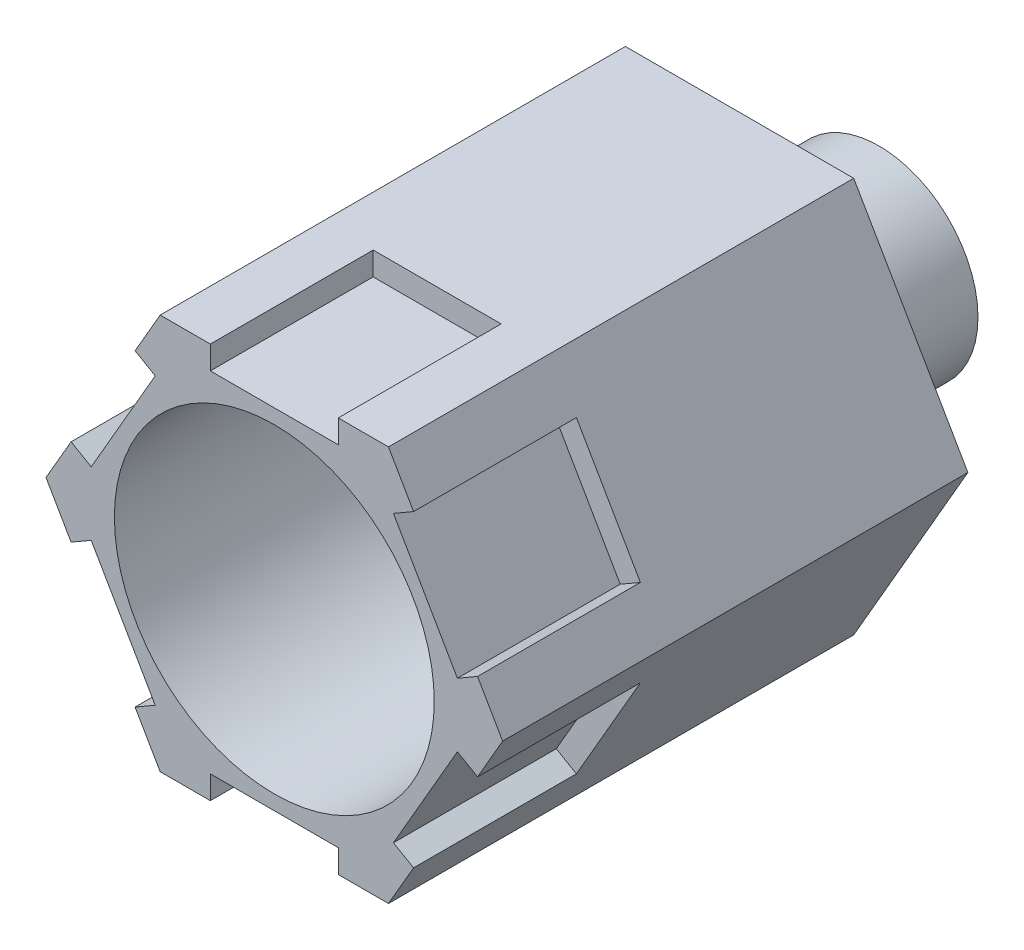
ISO-10303-21;
HEADER;
FILE_DESCRIPTION(('STEP AP214'),'2;1');
FILE_NAME('part.step','',(''),(''),'','','');
FILE_SCHEMA(('AUTOMOTIVE_DESIGN { 1 0 10303 214 1 1 1 1 }'));
ENDSEC;
DATA;
#1=APPLICATION_CONTEXT('core data for automotive mechanical design processes');
#2=APPLICATION_PROTOCOL_DEFINITION('international standard','automotive_design',2000,#1);
#3=PRODUCT_CONTEXT('',#1,'mechanical');
#4=PRODUCT('Part','Part','',(#3));
#5=PRODUCT_RELATED_PRODUCT_CATEGORY('part','',(#4));
#6=PRODUCT_DEFINITION_FORMATION('','',#4);
#7=PRODUCT_DEFINITION_CONTEXT('part definition',#1,'design');
#8=PRODUCT_DEFINITION('design','',#6,#7);
#9=PRODUCT_DEFINITION_SHAPE('','',#8);
#10=(LENGTH_UNIT() NAMED_UNIT(*) SI_UNIT(.MILLI.,.METRE.));
#11=(NAMED_UNIT(*) PLANE_ANGLE_UNIT() SI_UNIT($,.RADIAN.));
#12=(NAMED_UNIT(*) SI_UNIT($,.STERADIAN.) SOLID_ANGLE_UNIT());
#13=UNCERTAINTY_MEASURE_WITH_UNIT(LENGTH_MEASURE(1.E-05),#10,'distance_accuracy_value','');
#14=(GEOMETRIC_REPRESENTATION_CONTEXT(3) GLOBAL_UNCERTAINTY_ASSIGNED_CONTEXT((#13)) GLOBAL_UNIT_ASSIGNED_CONTEXT((#10,
#11,#12)) REPRESENTATION_CONTEXT('',''));
#15=CARTESIAN_POINT('',(0.,0.,0.));
#16=DIRECTION('',(0.,0.,1.));
#17=DIRECTION('',(1.,0.,0.));
#18=AXIS2_PLACEMENT_3D('',#15,#16,#17);
#19=CARTESIAN_POINT('',(0.,0.,38.));
#20=DIRECTION('',(0.,0.,1.));
#21=DIRECTION('',(1.,0.,0.));
#22=AXIS2_PLACEMENT_3D('',#19,#20,#21);
#23=PLANE('',#22);
#24=DIRECTION('',(-0.866025403784438,-0.500000000000001,0.));
#25=VECTOR('',#24,1.);
#26=CARTESIAN_POINT('',(2.15747728811182,13.2631397208144,38.));
#27=LINE('',#26,#25);
#28=CARTESIAN_POINT('',(3.8895280956807,14.2631397208144,38.));
#29=VERTEX_POINT('',#28);
#30=CARTESIAN_POINT('',(2.15747728811182,13.2631397208144,38.));
#31=VERTEX_POINT('',#30);
#32=EDGE_CURVE('E289',#29,#31,#27,.T.);
#33=ORIENTED_EDGE('',*,*,#32,.F.);
#34=DIRECTION('',(-0.5,0.866025403784438,0.));
#35=VECTOR('',#34,1.);
#36=CARTESIAN_POINT('',(3.8895280956807,14.2631397208144,38.));
#37=LINE('',#36,#35);
#38=CARTESIAN_POINT('',(9.3895280956807,4.73686027918559,38.));
#39=VERTEX_POINT('',#38);
#40=EDGE_CURVE('E279',#39,#29,#37,.T.);
#41=ORIENTED_EDGE('',*,*,#40,.F.);
#42=DIRECTION('',(0.866025403784438,0.500000000000001,0.));
#43=VECTOR('',#42,1.);
#44=CARTESIAN_POINT('',(7.65747728811183,3.73686027918559,38.));
#45=LINE('',#44,#43);
#46=CARTESIAN_POINT('',(7.65747728811183,3.73686027918559,38.));
#47=VERTEX_POINT('',#46);
#48=EDGE_CURVE('E291',#47,#39,#45,.T.);
#49=ORIENTED_EDGE('',*,*,#48,.F.);
#50=DIRECTION('',(0.5,-0.866025403784439,0.));
#51=VECTOR('',#50,1.);
#52=CARTESIAN_POINT('',(0.,17.,38.));
#53=LINE('',#52,#51);
#54=CARTESIAN_POINT('',(9.81495457622364,0.,38.));
#55=VERTEX_POINT('',#54);
#56=EDGE_CURVE('E456',#47,#55,#53,.T.);
#57=ORIENTED_EDGE('',*,*,#56,.T.);
#58=DIRECTION('',(1.,0.,0.));
#59=VECTOR('',#58,1.);
#60=CARTESIAN_POINT('',(9.81495457622364,0.,38.));
#61=LINE('',#60,#59);
#62=CARTESIAN_POINT('',(14.1299091524473,0.,38.));
#63=VERTEX_POINT('',#62);
#64=EDGE_CURVE('E461',#55,#63,#61,.T.);
#65=ORIENTED_EDGE('',*,*,#64,.T.);
#66=DIRECTION('',(0.,-1.,0.));
#67=VECTOR('',#66,1.);
#68=CARTESIAN_POINT('',(14.1299091524473,0.,38.));
#69=LINE('',#68,#67);
#70=CARTESIAN_POINT('',(14.1299091524473,2.,38.));
#71=VERTEX_POINT('',#70);
#72=EDGE_CURVE('E299',#71,#63,#69,.T.);
#73=ORIENTED_EDGE('',*,*,#72,.F.);
#74=DIRECTION('',(-1.,0.,0.));
#75=VECTOR('',#74,1.);
#76=CARTESIAN_POINT('',(14.1299091524473,2.,38.));
#77=LINE('',#76,#75);
#78=CARTESIAN_POINT('',(25.1299091524473,2.,38.));
#79=VERTEX_POINT('',#78);
#80=EDGE_CURVE('E412',#79,#71,#77,.T.);
#81=ORIENTED_EDGE('',*,*,#80,.F.);
#82=DIRECTION('',(0.,1.,0.));
#83=VECTOR('',#82,1.);
#84=CARTESIAN_POINT('',(25.1299091524473,0.,38.));
#85=LINE('',#84,#83);
#86=CARTESIAN_POINT('',(25.1299091524473,0.,38.));
#87=VERTEX_POINT('',#86);
#88=EDGE_CURVE('E423',#87,#79,#85,.T.);
#89=ORIENTED_EDGE('',*,*,#88,.F.);
#90=CARTESIAN_POINT('',(29.4448637286709,0.,38.));
#91=VERTEX_POINT('',#90);
#92=EDGE_CURVE('E460',#87,#91,#61,.T.);
#93=ORIENTED_EDGE('',*,*,#92,.T.);
#94=DIRECTION('',(0.5,0.866025403784439,0.));
#95=VECTOR('',#94,1.);
#96=CARTESIAN_POINT('',(29.4448637286709,0.,38.));
#97=LINE('',#96,#95);
#98=CARTESIAN_POINT('',(31.6023410167827,3.7368602791856,38.));
#99=VERTEX_POINT('',#98);
#100=EDGE_CURVE('E443',#91,#99,#97,.T.);
#101=ORIENTED_EDGE('',*,*,#100,.T.);
#102=DIRECTION('',(0.866025403784439,-0.499999999999999,0.));
#103=VECTOR('',#102,1.);
#104=CARTESIAN_POINT('',(31.6023410167827,3.7368602791856,38.));
#105=LINE('',#104,#103);
#106=CARTESIAN_POINT('',(29.8702902092139,4.7368602791856,38.));
#107=VERTEX_POINT('',#106);
#108=EDGE_CURVE('E275',#107,#99,#105,.T.);
#109=ORIENTED_EDGE('',*,*,#108,.F.);
#110=DIRECTION('',(-0.499999999999999,-0.866025403784439,0.));
#111=VECTOR('',#110,1.);
#112=CARTESIAN_POINT('',(29.8702902092139,4.7368602791856,38.));
#113=LINE('',#112,#111);
#114=CARTESIAN_POINT('',(35.3702902092139,14.2631397208144,38.));
#115=VERTEX_POINT('',#114);
#116=EDGE_CURVE('E388',#115,#107,#113,.T.);
#117=ORIENTED_EDGE('',*,*,#116,.F.);
#118=DIRECTION('',(-0.866025403784439,0.499999999999999,0.));
#119=VECTOR('',#118,1.);
#120=CARTESIAN_POINT('',(37.1023410167827,13.2631397208144,38.));
#121=LINE('',#120,#119);
#122=CARTESIAN_POINT('',(37.1023410167827,13.2631397208144,38.));
#123=VERTEX_POINT('',#122);
#124=EDGE_CURVE('E397',#123,#115,#121,.T.);
#125=ORIENTED_EDGE('',*,*,#124,.F.);
#126=CARTESIAN_POINT('',(39.2598183048946,17.,38.));
#127=VERTEX_POINT('',#126);
#128=EDGE_CURVE('E440',#123,#127,#97,.T.);
#129=ORIENTED_EDGE('',*,*,#128,.T.);
#130=DIRECTION('',(-0.5,0.866025403784439,0.));
#131=VECTOR('',#130,1.);
#132=CARTESIAN_POINT('',(39.2598183048946,17.,38.));
#133=LINE('',#132,#131);
#134=CARTESIAN_POINT('',(37.1023410167827,20.7368602791856,38.));
#135=VERTEX_POINT('',#134);
#136=EDGE_CURVE('E243',#127,#135,#133,.T.);
#137=ORIENTED_EDGE('',*,*,#136,.T.);
#138=DIRECTION('',(0.866025403784439,0.5,0.));
#139=VECTOR('',#138,1.);
#140=CARTESIAN_POINT('',(37.1023410167827,20.7368602791856,38.));
#141=LINE('',#140,#139);
#142=CARTESIAN_POINT('',(35.3702902092139,19.7368602791856,38.));
#143=VERTEX_POINT('',#142);
#144=EDGE_CURVE('E372',#143,#135,#141,.T.);
#145=ORIENTED_EDGE('',*,*,#144,.F.);
#146=DIRECTION('',(0.500000000000001,-0.866025403784438,0.));
#147=VECTOR('',#146,1.);
#148=CARTESIAN_POINT('',(35.3702902092139,19.7368602791856,38.));
#149=LINE('',#148,#147);
#150=CARTESIAN_POINT('',(29.8702902092138,29.2631397208144,38.));
#151=VERTEX_POINT('',#150);
#152=EDGE_CURVE('E364',#151,#143,#149,.T.);
#153=ORIENTED_EDGE('',*,*,#152,.F.);
#154=DIRECTION('',(-0.866025403784438,-0.500000000000001,0.));
#155=VECTOR('',#154,1.);
#156=CARTESIAN_POINT('',(31.6023410167827,30.2631397208144,38.));
#157=LINE('',#156,#155);
#158=CARTESIAN_POINT('',(31.6023410167827,30.2631397208144,38.));
#159=VERTEX_POINT('',#158);
#160=EDGE_CURVE('E374',#159,#151,#157,.T.);
#161=ORIENTED_EDGE('',*,*,#160,.F.);
#162=CARTESIAN_POINT('',(29.4448637286709,34.,38.));
#163=VERTEX_POINT('',#162);
#164=EDGE_CURVE('E446',#159,#163,#133,.T.);
#165=ORIENTED_EDGE('',*,*,#164,.T.);
#166=DIRECTION('',(-1.,0.,0.));
#167=VECTOR('',#166,1.);
#168=CARTESIAN_POINT('',(29.4448637286709,34.,38.));
#169=LINE('',#168,#167);
#170=CARTESIAN_POINT('',(25.1299091524473,34.,38.));
#171=VERTEX_POINT('',#170);
#172=EDGE_CURVE('E449',#163,#171,#169,.T.);
#173=ORIENTED_EDGE('',*,*,#172,.T.);
#174=DIRECTION('',(0.,1.,0.));
#175=VECTOR('',#174,1.);
#176=CARTESIAN_POINT('',(25.1299091524473,34.,38.));
#177=LINE('',#176,#175);
#178=CARTESIAN_POINT('',(25.1299091524473,32.,38.));
#179=VERTEX_POINT('',#178);
#180=EDGE_CURVE('E347',#179,#171,#177,.T.);
#181=ORIENTED_EDGE('',*,*,#180,.F.);
#182=DIRECTION('',(1.,0.,0.));
#183=VECTOR('',#182,1.);
#184=CARTESIAN_POINT('',(25.1299091524473,32.,38.));
#185=LINE('',#184,#183);
#186=CARTESIAN_POINT('',(14.1299091524473,32.,38.));
#187=VERTEX_POINT('',#186);
#188=EDGE_CURVE('E337',#187,#179,#185,.T.);
#189=ORIENTED_EDGE('',*,*,#188,.F.);
#190=DIRECTION('',(0.,-1.,0.));
#191=VECTOR('',#190,1.);
#192=CARTESIAN_POINT('',(14.1299091524473,34.,38.));
#193=LINE('',#192,#191);
#194=CARTESIAN_POINT('',(14.1299091524473,34.,38.));
#195=VERTEX_POINT('',#194);
#196=EDGE_CURVE('E349',#195,#187,#193,.T.);
#197=ORIENTED_EDGE('',*,*,#196,.F.);
#198=CARTESIAN_POINT('',(9.81495457622364,34.,38.));
#199=VERTEX_POINT('',#198);
#200=EDGE_CURVE('E448',#195,#199,#169,.T.);
#201=ORIENTED_EDGE('',*,*,#200,.T.);
#202=DIRECTION('',(-0.5,-0.866025403784439,0.));
#203=VECTOR('',#202,1.);
#204=CARTESIAN_POINT('',(9.81495457622364,34.,38.));
#205=LINE('',#204,#203);
#206=CARTESIAN_POINT('',(7.65747728811182,30.2631397208144,38.));
#207=VERTEX_POINT('',#206);
#208=EDGE_CURVE('E453',#199,#207,#205,.T.);
#209=ORIENTED_EDGE('',*,*,#208,.T.);
#210=DIRECTION('',(-0.866025403784439,0.5,0.));
#211=VECTOR('',#210,1.);
#212=CARTESIAN_POINT('',(7.65747728811182,30.2631397208144,38.));
#213=LINE('',#212,#211);
#214=CARTESIAN_POINT('',(9.3895280956807,29.2631397208144,38.));
#215=VERTEX_POINT('',#214);
#216=EDGE_CURVE('E319',#215,#207,#213,.T.);
#217=ORIENTED_EDGE('',*,*,#216,.F.);
#218=DIRECTION('',(0.5,0.866025403784439,0.));
#219=VECTOR('',#218,1.);
#220=CARTESIAN_POINT('',(9.3895280956807,29.2631397208144,38.));
#221=LINE('',#220,#219);
#222=CARTESIAN_POINT('',(3.8895280956807,19.7368602791856,38.));
#223=VERTEX_POINT('',#222);
#224=EDGE_CURVE('E309',#223,#215,#221,.T.);
#225=ORIENTED_EDGE('',*,*,#224,.F.);
#226=DIRECTION('',(0.866025403784439,-0.499999999999999,0.));
#227=VECTOR('',#226,1.);
#228=CARTESIAN_POINT('',(2.15747728811182,20.7368602791856,38.));
#229=LINE('',#228,#227);
#230=CARTESIAN_POINT('',(2.15747728811182,20.7368602791856,38.));
#231=VERTEX_POINT('',#230);
#232=EDGE_CURVE('E321',#231,#223,#229,.T.);
#233=ORIENTED_EDGE('',*,*,#232,.F.);
#234=CARTESIAN_POINT('',(0.,17.,38.));
#235=VERTEX_POINT('',#234);
#236=EDGE_CURVE('E452',#231,#235,#205,.T.);
#237=ORIENTED_EDGE('',*,*,#236,.T.);
#238=EDGE_CURVE('E457',#235,#31,#53,.T.);
#239=ORIENTED_EDGE('',*,*,#238,.T.);
#240=EDGE_LOOP('',(#33,#41,#49,#57,#65,#73,#81,#89,#93,#101,#109,#117,#125,#129,#137,#145,#153,
#161,#165,#173,#181,#189,#197,#201,#209,#217,#225,#233,#237,#239));
#241=FACE_BOUND('',#240,.T.);
#242=CARTESIAN_POINT('',(19.6299091524473,17.,38.));
#243=DIRECTION('',(0.,0.,1.));
#244=DIRECTION('',(1.,0.,0.));
#245=AXIS2_PLACEMENT_3D('',#242,#243,#244);
#246=CIRCLE('',#245,13.75);
#247=CARTESIAN_POINT('',(33.3799091524473,17.,38.));
#248=VERTEX_POINT('',#247);
#249=EDGE_CURVE('E437',#248,#248,#246,.T.);
#250=ORIENTED_EDGE('',*,*,#249,.F.);
#251=EDGE_LOOP('',(#250));
#252=FACE_BOUND('',#251,.T.);
#253=ADVANCED_FACE('F33',(#241,#252),#23,.T.);
#254=CARTESIAN_POINT('',(29.4448637286709,0.,38.));
#255=DIRECTION('',(-0.866025403784439,0.5,0.));
#256=DIRECTION('',(-0.5,-0.866025403784439,0.));
#257=AXIS2_PLACEMENT_3D('',#254,#255,#256);
#258=PLANE('',#257);
#259=DIRECTION('',(0.499999999999999,0.866025403784439,0.));
#260=VECTOR('',#259,1.);
#261=CARTESIAN_POINT('',(31.6023410167827,3.7368602791856,24.));
#262=LINE('',#261,#260);
#263=CARTESIAN_POINT('',(31.6023410167827,3.7368602791856,24.));
#264=VERTEX_POINT('',#263);
#265=CARTESIAN_POINT('',(37.1023410167827,13.2631397208144,24.));
#266=VERTEX_POINT('',#265);
#267=EDGE_CURVE('E387',#264,#266,#262,.T.);
#268=ORIENTED_EDGE('',*,*,#267,.F.);
#269=DIRECTION('',(0.,0.,1.));
#270=VECTOR('',#269,1.);
#271=CARTESIAN_POINT('',(31.6023410167827,3.7368602791856,24.));
#272=LINE('',#271,#270);
#273=EDGE_CURVE('E395',#264,#99,#272,.T.);
#274=ORIENTED_EDGE('',*,*,#273,.T.);
#275=ORIENTED_EDGE('',*,*,#100,.F.);
#276=DIRECTION('',(0.,0.,-1.));
#277=VECTOR('',#276,1.);
#278=CARTESIAN_POINT('',(29.4448637286709,0.,38.));
#279=LINE('',#278,#277);
#280=CARTESIAN_POINT('',(29.4448637286709,0.,-2.));
#281=VERTEX_POINT('',#280);
#282=EDGE_CURVE('E251',#91,#281,#279,.T.);
#283=ORIENTED_EDGE('',*,*,#282,.T.);
#284=DIRECTION('',(-0.5,-0.866025403784439,0.));
#285=VECTOR('',#284,1.);
#286=CARTESIAN_POINT('',(39.2598183048946,17.,-2.));
#287=LINE('',#286,#285);
#288=CARTESIAN_POINT('',(39.2598183048946,17.,-2.));
#289=VERTEX_POINT('',#288);
#290=EDGE_CURVE('E247',#289,#281,#287,.T.);
#291=ORIENTED_EDGE('',*,*,#290,.F.);
#292=DIRECTION('',(0.,0.,-1.));
#293=VECTOR('',#292,1.);
#294=CARTESIAN_POINT('',(39.2598183048946,17.,38.));
#295=LINE('',#294,#293);
#296=EDGE_CURVE('E11',#127,#289,#295,.T.);
#297=ORIENTED_EDGE('',*,*,#296,.F.);
#298=ORIENTED_EDGE('',*,*,#128,.F.);
#299=DIRECTION('',(0.,0.,1.));
#300=VECTOR('',#299,1.);
#301=CARTESIAN_POINT('',(37.1023410167827,13.2631397208144,24.));
#302=LINE('',#301,#300);
#303=EDGE_CURVE('E405',#266,#123,#302,.T.);
#304=ORIENTED_EDGE('',*,*,#303,.F.);
#305=EDGE_LOOP('',(#268,#274,#275,#283,#291,#297,#298,#304));
#306=FACE_BOUND('',#305,.T.);
#307=ADVANCED_FACE('F35',(#306),#258,.F.);
#308=CARTESIAN_POINT('',(39.2598183048946,17.,38.));
#309=DIRECTION('',(-0.866025403784439,-0.5,0.));
#310=DIRECTION('',(0.5,-0.866025403784439,0.));
#311=AXIS2_PLACEMENT_3D('',#308,#309,#310);
#312=PLANE('',#311);
#313=DIRECTION('',(-0.500000000000001,0.866025403784438,0.));
#314=VECTOR('',#313,1.);
#315=CARTESIAN_POINT('',(37.1023410167827,20.7368602791856,24.));
#316=LINE('',#315,#314);
#317=CARTESIAN_POINT('',(37.1023410167827,20.7368602791856,24.));
#318=VERTEX_POINT('',#317);
#319=CARTESIAN_POINT('',(31.6023410167827,30.2631397208144,24.));
#320=VERTEX_POINT('',#319);
#321=EDGE_CURVE('E363',#318,#320,#316,.T.);
#322=ORIENTED_EDGE('',*,*,#321,.F.);
#323=DIRECTION('',(0.,0.,1.));
#324=VECTOR('',#323,1.);
#325=CARTESIAN_POINT('',(37.1023410167827,20.7368602791856,24.));
#326=LINE('',#325,#324);
#327=EDGE_CURVE('E371',#318,#135,#326,.T.);
#328=ORIENTED_EDGE('',*,*,#327,.T.);
#329=ORIENTED_EDGE('',*,*,#136,.F.);
#330=ORIENTED_EDGE('',*,*,#296,.T.);
#331=DIRECTION('',(0.5,-0.866025403784439,0.));
#332=VECTOR('',#331,1.);
#333=CARTESIAN_POINT('',(29.4448637286709,34.,-2.));
#334=LINE('',#333,#332);
#335=CARTESIAN_POINT('',(29.4448637286709,34.,-2.));
#336=VERTEX_POINT('',#335);
#337=EDGE_CURVE('E240',#336,#289,#334,.T.);
#338=ORIENTED_EDGE('',*,*,#337,.F.);
#339=DIRECTION('',(0.,0.,-1.));
#340=VECTOR('',#339,1.);
#341=CARTESIAN_POINT('',(29.4448637286709,34.,38.));
#342=LINE('',#341,#340);
#343=EDGE_CURVE('E42',#163,#336,#342,.T.);
#344=ORIENTED_EDGE('',*,*,#343,.F.);
#345=ORIENTED_EDGE('',*,*,#164,.F.);
#346=DIRECTION('',(0.,0.,1.));
#347=VECTOR('',#346,1.);
#348=CARTESIAN_POINT('',(31.6023410167827,30.2631397208144,24.));
#349=LINE('',#348,#347);
#350=EDGE_CURVE('E383',#320,#159,#349,.T.);
#351=ORIENTED_EDGE('',*,*,#350,.F.);
#352=EDGE_LOOP('',(#322,#328,#329,#330,#338,#344,#345,#351));
#353=FACE_BOUND('',#352,.T.);
#354=ADVANCED_FACE('F237',(#353),#312,.F.);
#355=CARTESIAN_POINT('',(29.4448637286709,34.,38.));
#356=DIRECTION('',(0.,-1.,0.));
#357=DIRECTION('',(0.,0.,-1.));
#358=AXIS2_PLACEMENT_3D('',#355,#356,#357);
#359=PLANE('',#358);
#360=DIRECTION('',(-1.,0.,0.));
#361=VECTOR('',#360,1.);
#362=CARTESIAN_POINT('',(25.1299091524473,34.,24.));
#363=LINE('',#362,#361);
#364=CARTESIAN_POINT('',(25.1299091524473,34.,24.));
#365=VERTEX_POINT('',#364);
#366=CARTESIAN_POINT('',(14.1299091524473,34.,24.));
#367=VERTEX_POINT('',#366);
#368=EDGE_CURVE('E336',#365,#367,#363,.T.);
#369=ORIENTED_EDGE('',*,*,#368,.F.);
#370=DIRECTION('',(0.,0.,1.));
#371=VECTOR('',#370,1.);
#372=CARTESIAN_POINT('',(25.1299091524473,34.,24.));
#373=LINE('',#372,#371);
#374=EDGE_CURVE('E346',#365,#171,#373,.T.);
#375=ORIENTED_EDGE('',*,*,#374,.T.);
#376=ORIENTED_EDGE('',*,*,#172,.F.);
#377=ORIENTED_EDGE('',*,*,#343,.T.);
#378=DIRECTION('',(1.,0.,0.));
#379=VECTOR('',#378,1.);
#380=CARTESIAN_POINT('',(9.81495457622364,34.,-2.));
#381=LINE('',#380,#379);
#382=CARTESIAN_POINT('',(9.81495457622364,34.,-2.));
#383=VERTEX_POINT('',#382);
#384=EDGE_CURVE('E261',#383,#336,#381,.T.);
#385=ORIENTED_EDGE('',*,*,#384,.F.);
#386=DIRECTION('',(0.,0.,-1.));
#387=VECTOR('',#386,1.);
#388=CARTESIAN_POINT('',(9.81495457622364,34.,38.));
#389=LINE('',#388,#387);
#390=EDGE_CURVE('E469',#199,#383,#389,.T.);
#391=ORIENTED_EDGE('',*,*,#390,.F.);
#392=ORIENTED_EDGE('',*,*,#200,.F.);
#393=DIRECTION('',(0.,0.,1.));
#394=VECTOR('',#393,1.);
#395=CARTESIAN_POINT('',(14.1299091524473,34.,24.));
#396=LINE('',#395,#394);
#397=EDGE_CURVE('E358',#367,#195,#396,.T.);
#398=ORIENTED_EDGE('',*,*,#397,.F.);
#399=EDGE_LOOP('',(#369,#375,#376,#377,#385,#391,#392,#398));
#400=FACE_BOUND('',#399,.T.);
#401=ADVANCED_FACE('F474',(#400),#359,.F.);
#402=CARTESIAN_POINT('',(9.81495457622364,34.,38.));
#403=DIRECTION('',(0.866025403784439,-0.5,0.));
#404=DIRECTION('',(0.5,0.866025403784439,0.));
#405=AXIS2_PLACEMENT_3D('',#402,#403,#404);
#406=PLANE('',#405);
#407=DIRECTION('',(-0.5,-0.866025403784439,0.));
#408=VECTOR('',#407,1.);
#409=CARTESIAN_POINT('',(7.65747728811182,30.2631397208144,24.));
#410=LINE('',#409,#408);
#411=CARTESIAN_POINT('',(7.65747728811182,30.2631397208144,24.));
#412=VERTEX_POINT('',#411);
#413=CARTESIAN_POINT('',(2.15747728811182,20.7368602791856,24.));
#414=VERTEX_POINT('',#413);
#415=EDGE_CURVE('E308',#412,#414,#410,.T.);
#416=ORIENTED_EDGE('',*,*,#415,.F.);
#417=DIRECTION('',(0.,0.,1.));
#418=VECTOR('',#417,1.);
#419=CARTESIAN_POINT('',(7.65747728811182,30.2631397208144,24.));
#420=LINE('',#419,#418);
#421=EDGE_CURVE('E318',#412,#207,#420,.T.);
#422=ORIENTED_EDGE('',*,*,#421,.T.);
#423=ORIENTED_EDGE('',*,*,#208,.F.);
#424=ORIENTED_EDGE('',*,*,#390,.T.);
#425=DIRECTION('',(0.5,0.866025403784439,0.));
#426=VECTOR('',#425,1.);
#427=CARTESIAN_POINT('',(0.,17.,-2.));
#428=LINE('',#427,#426);
#429=CARTESIAN_POINT('',(0.,17.,-2.));
#430=VERTEX_POINT('',#429);
#431=EDGE_CURVE('E272',#430,#383,#428,.T.);
#432=ORIENTED_EDGE('',*,*,#431,.F.);
#433=DIRECTION('',(0.,0.,-1.));
#434=VECTOR('',#433,1.);
#435=CARTESIAN_POINT('',(0.,17.,38.));
#436=LINE('',#435,#434);
#437=EDGE_CURVE('E467',#235,#430,#436,.T.);
#438=ORIENTED_EDGE('',*,*,#437,.F.);
#439=ORIENTED_EDGE('',*,*,#236,.F.);
#440=DIRECTION('',(0.,0.,1.));
#441=VECTOR('',#440,1.);
#442=CARTESIAN_POINT('',(2.15747728811182,20.7368602791856,24.));
#443=LINE('',#442,#441);
#444=EDGE_CURVE('E330',#414,#231,#443,.T.);
#445=ORIENTED_EDGE('',*,*,#444,.F.);
#446=EDGE_LOOP('',(#416,#422,#423,#424,#432,#438,#439,#445));
#447=FACE_BOUND('',#446,.T.);
#448=ADVANCED_FACE('F526',(#447),#406,.F.);
#449=CARTESIAN_POINT('',(0.,17.,38.));
#450=DIRECTION('',(0.866025403784439,0.5,0.));
#451=DIRECTION('',(-0.5,0.866025403784439,0.));
#452=AXIS2_PLACEMENT_3D('',#449,#450,#451);
#453=PLANE('',#452);
#454=DIRECTION('',(0.5,-0.866025403784438,0.));
#455=VECTOR('',#454,1.);
#456=CARTESIAN_POINT('',(2.15747728811182,13.2631397208144,24.));
#457=LINE('',#456,#455);
#458=CARTESIAN_POINT('',(2.15747728811182,13.2631397208144,24.));
#459=VERTEX_POINT('',#458);
#460=CARTESIAN_POINT('',(7.65747728811183,3.73686027918559,24.));
#461=VERTEX_POINT('',#460);
#462=EDGE_CURVE('E278',#459,#461,#457,.T.);
#463=ORIENTED_EDGE('',*,*,#462,.F.);
#464=DIRECTION('',(0.,0.,1.));
#465=VECTOR('',#464,1.);
#466=CARTESIAN_POINT('',(2.15747728811182,13.2631397208144,24.));
#467=LINE('',#466,#465);
#468=EDGE_CURVE('E288',#459,#31,#467,.T.);
#469=ORIENTED_EDGE('',*,*,#468,.T.);
#470=ORIENTED_EDGE('',*,*,#238,.F.);
#471=ORIENTED_EDGE('',*,*,#437,.T.);
#472=DIRECTION('',(-0.5,0.866025403784439,0.));
#473=VECTOR('',#472,1.);
#474=CARTESIAN_POINT('',(9.81495457622364,0.,-2.));
#475=LINE('',#474,#473);
#476=CARTESIAN_POINT('',(9.81495457622364,0.,-2.));
#477=VERTEX_POINT('',#476);
#478=EDGE_CURVE('E269',#477,#430,#475,.T.);
#479=ORIENTED_EDGE('',*,*,#478,.F.);
#480=DIRECTION('',(0.,0.,-1.));
#481=VECTOR('',#480,1.);
#482=CARTESIAN_POINT('',(9.81495457622364,0.,38.));
#483=LINE('',#482,#481);
#484=EDGE_CURVE('E465',#55,#477,#483,.T.);
#485=ORIENTED_EDGE('',*,*,#484,.F.);
#486=ORIENTED_EDGE('',*,*,#56,.F.);
#487=DIRECTION('',(0.,0.,1.));
#488=VECTOR('',#487,1.);
#489=CARTESIAN_POINT('',(7.65747728811183,3.73686027918559,24.));
#490=LINE('',#489,#488);
#491=EDGE_CURVE('E302',#461,#47,#490,.T.);
#492=ORIENTED_EDGE('',*,*,#491,.F.);
#493=EDGE_LOOP('',(#463,#469,#470,#471,#479,#485,#486,#492));
#494=FACE_BOUND('',#493,.T.);
#495=ADVANCED_FACE('F522',(#494),#453,.F.);
#496=CARTESIAN_POINT('',(9.81495457622364,0.,38.));
#497=DIRECTION('',(0.,1.,0.));
#498=DIRECTION('',(0.,0.,1.));
#499=AXIS2_PLACEMENT_3D('',#496,#497,#498);
#500=PLANE('',#499);
#501=DIRECTION('',(1.,0.,0.));
#502=VECTOR('',#501,1.);
#503=CARTESIAN_POINT('',(14.1299091524473,0.,24.));
#504=LINE('',#503,#502);
#505=CARTESIAN_POINT('',(14.1299091524473,0.,24.));
#506=VERTEX_POINT('',#505);
#507=CARTESIAN_POINT('',(25.1299091524473,0.,24.));
#508=VERTEX_POINT('',#507);
#509=EDGE_CURVE('E411',#506,#508,#504,.T.);
#510=ORIENTED_EDGE('',*,*,#509,.F.);
#511=DIRECTION('',(0.,0.,1.));
#512=VECTOR('',#511,1.);
#513=CARTESIAN_POINT('',(14.1299091524473,0.,24.));
#514=LINE('',#513,#512);
#515=EDGE_CURVE('E421',#506,#63,#514,.T.);
#516=ORIENTED_EDGE('',*,*,#515,.T.);
#517=ORIENTED_EDGE('',*,*,#64,.F.);
#518=ORIENTED_EDGE('',*,*,#484,.T.);
#519=DIRECTION('',(-1.,0.,0.));
#520=VECTOR('',#519,1.);
#521=CARTESIAN_POINT('',(29.4448637286709,0.,-2.));
#522=LINE('',#521,#520);
#523=EDGE_CURVE('E255',#281,#477,#522,.T.);
#524=ORIENTED_EDGE('',*,*,#523,.F.);
#525=ORIENTED_EDGE('',*,*,#282,.F.);
#526=ORIENTED_EDGE('',*,*,#92,.F.);
#527=DIRECTION('',(0.,0.,1.));
#528=VECTOR('',#527,1.);
#529=CARTESIAN_POINT('',(25.1299091524473,0.,24.));
#530=LINE('',#529,#528);
#531=EDGE_CURVE('E433',#508,#87,#530,.T.);
#532=ORIENTED_EDGE('',*,*,#531,.F.);
#533=EDGE_LOOP('',(#510,#516,#517,#518,#524,#525,#526,#532));
#534=FACE_BOUND('',#533,.T.);
#535=ADVANCED_FACE('F519',(#534),#500,.F.);
#536=CARTESIAN_POINT('',(19.6299091524473,17.,38.));
#537=DIRECTION('',(0.,0.,-1.));
#538=DIRECTION('',(-1.,0.,0.));
#539=AXIS2_PLACEMENT_3D('',#536,#537,#538);
#540=CYLINDRICAL_SURFACE('',#539,13.75);
#541=ORIENTED_EDGE('',*,*,#249,.T.);
#542=EDGE_LOOP('',(#541));
#543=FACE_BOUND('',#542,.T.);
#544=CARTESIAN_POINT('',(19.6299091524473,17.,0.));
#545=DIRECTION('',(0.,0.,1.));
#546=DIRECTION('',(1.,0.,0.));
#547=AXIS2_PLACEMENT_3D('',#544,#545,#546);
#548=CIRCLE('',#547,13.75);
#549=CARTESIAN_POINT('',(33.3799091524473,17.,0.));
#550=VERTEX_POINT('',#549);
#551=EDGE_CURVE('E430',#550,#550,#548,.T.);
#552=ORIENTED_EDGE('',*,*,#551,.F.);
#553=EDGE_LOOP('',(#552));
#554=FACE_BOUND('',#553,.T.);
#555=ADVANCED_FACE('F517',(#543,#554),#540,.F.);
#556=CARTESIAN_POINT('',(14.1299091524473,0.,24.));
#557=DIRECTION('',(-1.,0.,0.));
#558=DIRECTION('',(0.,0.,1.));
#559=AXIS2_PLACEMENT_3D('',#556,#557,#558);
#560=PLANE('',#559);
#561=ORIENTED_EDGE('',*,*,#72,.T.);
#562=ORIENTED_EDGE('',*,*,#515,.F.);
#563=DIRECTION('',(0.,-1.,0.));
#564=VECTOR('',#563,1.);
#565=CARTESIAN_POINT('',(14.1299091524473,0.,24.));
#566=LINE('',#565,#564);
#567=CARTESIAN_POINT('',(14.1299091524473,2.,24.));
#568=VERTEX_POINT('',#567);
#569=EDGE_CURVE('E409',#568,#506,#566,.T.);
#570=ORIENTED_EDGE('',*,*,#569,.F.);
#571=DIRECTION('',(0.,0.,1.));
#572=VECTOR('',#571,1.);
#573=CARTESIAN_POINT('',(14.1299091524473,2.,24.));
#574=LINE('',#573,#572);
#575=EDGE_CURVE('E428',#568,#71,#574,.T.);
#576=ORIENTED_EDGE('',*,*,#575,.T.);
#577=EDGE_LOOP('',(#561,#562,#570,#576));
#578=FACE_BOUND('',#577,.T.);
#579=ADVANCED_FACE('F560',(#578),#560,.F.);
#580=CARTESIAN_POINT('',(14.1299091524473,2.,24.));
#581=DIRECTION('',(0.,1.,0.));
#582=DIRECTION('',(-1.,0.,0.));
#583=AXIS2_PLACEMENT_3D('',#580,#581,#582);
#584=PLANE('',#583);
#585=ORIENTED_EDGE('',*,*,#80,.T.);
#586=ORIENTED_EDGE('',*,*,#575,.F.);
#587=DIRECTION('',(-1.,0.,0.));
#588=VECTOR('',#587,1.);
#589=CARTESIAN_POINT('',(14.1299091524473,2.,24.));
#590=LINE('',#589,#588);
#591=CARTESIAN_POINT('',(25.1299091524473,2.,24.));
#592=VERTEX_POINT('',#591);
#593=EDGE_CURVE('E418',#592,#568,#590,.T.);
#594=ORIENTED_EDGE('',*,*,#593,.F.);
#595=DIRECTION('',(0.,0.,1.));
#596=VECTOR('',#595,1.);
#597=CARTESIAN_POINT('',(25.1299091524473,2.,24.));
#598=LINE('',#597,#596);
#599=EDGE_CURVE('E431',#592,#79,#598,.T.);
#600=ORIENTED_EDGE('',*,*,#599,.T.);
#601=EDGE_LOOP('',(#585,#586,#594,#600));
#602=FACE_BOUND('',#601,.T.);
#603=ADVANCED_FACE('F567',(#602),#584,.F.);
#604=CARTESIAN_POINT('',(25.1299091524473,0.,24.));
#605=DIRECTION('',(1.,0.,0.));
#606=DIRECTION('',(0.,1.,0.));
#607=AXIS2_PLACEMENT_3D('',#604,#605,#606);
#608=PLANE('',#607);
#609=ORIENTED_EDGE('',*,*,#88,.T.);
#610=ORIENTED_EDGE('',*,*,#599,.F.);
#611=DIRECTION('',(0.,1.,0.));
#612=VECTOR('',#611,1.);
#613=CARTESIAN_POINT('',(25.1299091524473,0.,24.));
#614=LINE('',#613,#612);
#615=EDGE_CURVE('E415',#508,#592,#614,.T.);
#616=ORIENTED_EDGE('',*,*,#615,.F.);
#617=ORIENTED_EDGE('',*,*,#531,.T.);
#618=EDGE_LOOP('',(#609,#610,#616,#617));
#619=FACE_BOUND('',#618,.T.);
#620=ADVANCED_FACE('F574',(#619),#608,.F.);
#621=CARTESIAN_POINT('',(0.,0.,24.));
#622=DIRECTION('',(0.,0.,-1.));
#623=DIRECTION('',(-1.,0.,0.));
#624=AXIS2_PLACEMENT_3D('',#621,#622,#623);
#625=PLANE('',#624);
#626=ORIENTED_EDGE('',*,*,#569,.T.);
#627=ORIENTED_EDGE('',*,*,#509,.T.);
#628=ORIENTED_EDGE('',*,*,#615,.T.);
#629=ORIENTED_EDGE('',*,*,#593,.T.);
#630=EDGE_LOOP('',(#626,#627,#628,#629));
#631=FACE_BOUND('',#630,.T.);
#632=ADVANCED_FACE('F582',(#631),#625,.F.);
#633=CARTESIAN_POINT('',(2.15747728811182,13.2631397208144,24.));
#634=DIRECTION('',(-0.500000000000001,0.866025403784438,0.));
#635=DIRECTION('',(-0.866025403784438,-0.500000000000001,0.));
#636=AXIS2_PLACEMENT_3D('',#633,#634,#635);
#637=PLANE('',#636);
#638=ORIENTED_EDGE('',*,*,#32,.T.);
#639=ORIENTED_EDGE('',*,*,#468,.F.);
#640=DIRECTION('',(-0.866025403784438,-0.500000000000001,0.));
#641=VECTOR('',#640,1.);
#642=CARTESIAN_POINT('',(2.15747728811182,13.2631397208144,24.));
#643=LINE('',#642,#641);
#644=CARTESIAN_POINT('',(3.8895280956807,14.2631397208144,24.));
#645=VERTEX_POINT('',#644);
#646=EDGE_CURVE('E276',#645,#459,#643,.T.);
#647=ORIENTED_EDGE('',*,*,#646,.F.);
#648=DIRECTION('',(0.,0.,1.));
#649=VECTOR('',#648,1.);
#650=CARTESIAN_POINT('',(3.8895280956807,14.2631397208144,24.));
#651=LINE('',#650,#649);
#652=EDGE_CURVE('E297',#645,#29,#651,.T.);
#653=ORIENTED_EDGE('',*,*,#652,.T.);
#654=EDGE_LOOP('',(#638,#639,#647,#653));
#655=FACE_BOUND('',#654,.T.);
#656=ADVANCED_FACE('F590',(#655),#637,.F.);
#657=CARTESIAN_POINT('',(3.8895280956807,14.2631397208144,24.));
#658=DIRECTION('',(0.866025403784438,0.5,0.));
#659=DIRECTION('',(-0.5,0.866025403784438,0.));
#660=AXIS2_PLACEMENT_3D('',#657,#658,#659);
#661=PLANE('',#660);
#662=ORIENTED_EDGE('',*,*,#40,.T.);
#663=ORIENTED_EDGE('',*,*,#652,.F.);
#664=DIRECTION('',(-0.5,0.866025403784438,0.));
#665=VECTOR('',#664,1.);
#666=CARTESIAN_POINT('',(3.8895280956807,14.2631397208144,24.));
#667=LINE('',#666,#665);
#668=CARTESIAN_POINT('',(9.3895280956807,4.73686027918559,24.));
#669=VERTEX_POINT('',#668);
#670=EDGE_CURVE('E285',#669,#645,#667,.T.);
#671=ORIENTED_EDGE('',*,*,#670,.F.);
#672=DIRECTION('',(0.,0.,1.));
#673=VECTOR('',#672,1.);
#674=CARTESIAN_POINT('',(9.3895280956807,4.73686027918559,24.));
#675=LINE('',#674,#673);
#676=EDGE_CURVE('E300',#669,#39,#675,.T.);
#677=ORIENTED_EDGE('',*,*,#676,.T.);
#678=EDGE_LOOP('',(#662,#663,#671,#677));
#679=FACE_BOUND('',#678,.T.);
#680=ADVANCED_FACE('F598',(#679),#661,.F.);
#681=CARTESIAN_POINT('',(7.65747728811183,3.73686027918559,24.));
#682=DIRECTION('',(0.500000000000001,-0.866025403784438,0.));
#683=DIRECTION('',(0.866025403784438,0.500000000000001,0.));
#684=AXIS2_PLACEMENT_3D('',#681,#682,#683);
#685=PLANE('',#684);
#686=ORIENTED_EDGE('',*,*,#48,.T.);
#687=ORIENTED_EDGE('',*,*,#676,.F.);
#688=DIRECTION('',(0.866025403784438,0.500000000000001,0.));
#689=VECTOR('',#688,1.);
#690=CARTESIAN_POINT('',(7.65747728811183,3.73686027918559,24.));
#691=LINE('',#690,#689);
#692=EDGE_CURVE('E282',#461,#669,#691,.T.);
#693=ORIENTED_EDGE('',*,*,#692,.F.);
#694=ORIENTED_EDGE('',*,*,#491,.T.);
#695=EDGE_LOOP('',(#686,#687,#693,#694));
#696=FACE_BOUND('',#695,.T.);
#697=ADVANCED_FACE('F606',(#696),#685,.F.);
#698=CARTESIAN_POINT('',(0.,0.,24.));
#699=DIRECTION('',(0.,0.,-1.));
#700=DIRECTION('',(-1.,0.,0.));
#701=AXIS2_PLACEMENT_3D('',#698,#699,#700);
#702=PLANE('',#701);
#703=ORIENTED_EDGE('',*,*,#646,.T.);
#704=ORIENTED_EDGE('',*,*,#462,.T.);
#705=ORIENTED_EDGE('',*,*,#692,.T.);
#706=ORIENTED_EDGE('',*,*,#670,.T.);
#707=EDGE_LOOP('',(#703,#704,#705,#706));
#708=FACE_BOUND('',#707,.T.);
#709=ADVANCED_FACE('F614',(#708),#702,.F.);
#710=CARTESIAN_POINT('',(7.65747728811182,30.2631397208144,24.));
#711=DIRECTION('',(0.5,0.866025403784439,0.));
#712=DIRECTION('',(-0.866025403784439,0.5,0.));
#713=AXIS2_PLACEMENT_3D('',#710,#711,#712);
#714=PLANE('',#713);
#715=ORIENTED_EDGE('',*,*,#216,.T.);
#716=ORIENTED_EDGE('',*,*,#421,.F.);
#717=DIRECTION('',(-0.866025403784439,0.5,0.));
#718=VECTOR('',#717,1.);
#719=CARTESIAN_POINT('',(7.65747728811182,30.2631397208144,24.));
#720=LINE('',#719,#718);
#721=CARTESIAN_POINT('',(9.3895280956807,29.2631397208144,24.));
#722=VERTEX_POINT('',#721);
#723=EDGE_CURVE('E306',#722,#412,#720,.T.);
#724=ORIENTED_EDGE('',*,*,#723,.F.);
#725=DIRECTION('',(0.,0.,1.));
#726=VECTOR('',#725,1.);
#727=CARTESIAN_POINT('',(9.3895280956807,29.2631397208144,24.));
#728=LINE('',#727,#726);
#729=EDGE_CURVE('E292',#722,#215,#728,.T.);
#730=ORIENTED_EDGE('',*,*,#729,.T.);
#731=EDGE_LOOP('',(#715,#716,#724,#730));
#732=FACE_BOUND('',#731,.T.);
#733=ADVANCED_FACE('F622',(#732),#714,.F.);
#734=CARTESIAN_POINT('',(9.3895280956807,29.2631397208144,24.));
#735=DIRECTION('',(0.866025403784439,-0.5,0.));
#736=DIRECTION('',(0.5,0.866025403784439,0.));
#737=AXIS2_PLACEMENT_3D('',#734,#735,#736);
#738=PLANE('',#737);
#739=ORIENTED_EDGE('',*,*,#224,.T.);
#740=ORIENTED_EDGE('',*,*,#729,.F.);
#741=DIRECTION('',(0.5,0.866025403784439,0.));
#742=VECTOR('',#741,1.);
#743=CARTESIAN_POINT('',(9.3895280956807,29.2631397208144,24.));
#744=LINE('',#743,#742);
#745=CARTESIAN_POINT('',(3.8895280956807,19.7368602791856,24.));
#746=VERTEX_POINT('',#745);
#747=EDGE_CURVE('E315',#746,#722,#744,.T.);
#748=ORIENTED_EDGE('',*,*,#747,.F.);
#749=DIRECTION('',(0.,0.,1.));
#750=VECTOR('',#749,1.);
#751=CARTESIAN_POINT('',(3.8895280956807,19.7368602791856,24.));
#752=LINE('',#751,#750);
#753=EDGE_CURVE('E328',#746,#223,#752,.T.);
#754=ORIENTED_EDGE('',*,*,#753,.T.);
#755=EDGE_LOOP('',(#739,#740,#748,#754));
#756=FACE_BOUND('',#755,.T.);
#757=ADVANCED_FACE('F630',(#756),#738,.F.);
#758=CARTESIAN_POINT('',(2.15747728811182,20.7368602791856,24.));
#759=DIRECTION('',(-0.499999999999999,-0.866025403784439,0.));
#760=DIRECTION('',(0.866025403784439,-0.499999999999999,0.));
#761=AXIS2_PLACEMENT_3D('',#758,#759,#760);
#762=PLANE('',#761);
#763=ORIENTED_EDGE('',*,*,#232,.T.);
#764=ORIENTED_EDGE('',*,*,#753,.F.);
#765=DIRECTION('',(0.866025403784439,-0.499999999999999,0.));
#766=VECTOR('',#765,1.);
#767=CARTESIAN_POINT('',(2.15747728811182,20.7368602791856,24.));
#768=LINE('',#767,#766);
#769=EDGE_CURVE('E312',#414,#746,#768,.T.);
#770=ORIENTED_EDGE('',*,*,#769,.F.);
#771=ORIENTED_EDGE('',*,*,#444,.T.);
#772=EDGE_LOOP('',(#763,#764,#770,#771));
#773=FACE_BOUND('',#772,.T.);
#774=ADVANCED_FACE('F638',(#773),#762,.F.);
#775=CARTESIAN_POINT('',(0.,0.,24.));
#776=DIRECTION('',(0.,0.,-1.));
#777=DIRECTION('',(-1.,0.,0.));
#778=AXIS2_PLACEMENT_3D('',#775,#776,#777);
#779=PLANE('',#778);
#780=ORIENTED_EDGE('',*,*,#723,.T.);
#781=ORIENTED_EDGE('',*,*,#415,.T.);
#782=ORIENTED_EDGE('',*,*,#769,.T.);
#783=ORIENTED_EDGE('',*,*,#747,.T.);
#784=EDGE_LOOP('',(#780,#781,#782,#783));
#785=FACE_BOUND('',#784,.T.);
#786=ADVANCED_FACE('F646',(#785),#779,.F.);
#787=CARTESIAN_POINT('',(25.1299091524473,34.,24.));
#788=DIRECTION('',(1.,0.,0.));
#789=DIRECTION('',(0.,0.,-1.));
#790=AXIS2_PLACEMENT_3D('',#787,#788,#789);
#791=PLANE('',#790);
#792=ORIENTED_EDGE('',*,*,#180,.T.);
#793=ORIENTED_EDGE('',*,*,#374,.F.);
#794=DIRECTION('',(0.,1.,0.));
#795=VECTOR('',#794,1.);
#796=CARTESIAN_POINT('',(25.1299091524473,34.,24.));
#797=LINE('',#796,#795);
#798=CARTESIAN_POINT('',(25.1299091524473,32.,24.));
#799=VERTEX_POINT('',#798);
#800=EDGE_CURVE('E334',#799,#365,#797,.T.);
#801=ORIENTED_EDGE('',*,*,#800,.F.);
#802=DIRECTION('',(0.,0.,1.));
#803=VECTOR('',#802,1.);
#804=CARTESIAN_POINT('',(25.1299091524473,32.,24.));
#805=LINE('',#804,#803);
#806=EDGE_CURVE('E322',#799,#179,#805,.T.);
#807=ORIENTED_EDGE('',*,*,#806,.T.);
#808=EDGE_LOOP('',(#792,#793,#801,#807));
#809=FACE_BOUND('',#808,.T.);
#810=ADVANCED_FACE('F654',(#809),#791,.F.);
#811=CARTESIAN_POINT('',(25.1299091524473,32.,24.));
#812=DIRECTION('',(0.,-1.,0.));
#813=DIRECTION('',(0.,0.,-1.));
#814=AXIS2_PLACEMENT_3D('',#811,#812,#813);
#815=PLANE('',#814);
#816=ORIENTED_EDGE('',*,*,#188,.T.);
#817=ORIENTED_EDGE('',*,*,#806,.F.);
#818=DIRECTION('',(1.,0.,0.));
#819=VECTOR('',#818,1.);
#820=CARTESIAN_POINT('',(25.1299091524473,32.,24.));
#821=LINE('',#820,#819);
#822=CARTESIAN_POINT('',(14.1299091524473,32.,24.));
#823=VERTEX_POINT('',#822);
#824=EDGE_CURVE('E343',#823,#799,#821,.T.);
#825=ORIENTED_EDGE('',*,*,#824,.F.);
#826=DIRECTION('',(0.,0.,1.));
#827=VECTOR('',#826,1.);
#828=CARTESIAN_POINT('',(14.1299091524473,32.,24.));
#829=LINE('',#828,#827);
#830=EDGE_CURVE('E356',#823,#187,#829,.T.);
#831=ORIENTED_EDGE('',*,*,#830,.T.);
#832=EDGE_LOOP('',(#816,#817,#825,#831));
#833=FACE_BOUND('',#832,.T.);
#834=ADVANCED_FACE('F662',(#833),#815,.F.);
#835=CARTESIAN_POINT('',(14.1299091524473,34.,24.));
#836=DIRECTION('',(-1.,0.,0.));
#837=DIRECTION('',(0.,-1.,0.));
#838=AXIS2_PLACEMENT_3D('',#835,#836,#837);
#839=PLANE('',#838);
#840=ORIENTED_EDGE('',*,*,#196,.T.);
#841=ORIENTED_EDGE('',*,*,#830,.F.);
#842=DIRECTION('',(0.,-1.,0.));
#843=VECTOR('',#842,1.);
#844=CARTESIAN_POINT('',(14.1299091524473,34.,24.));
#845=LINE('',#844,#843);
#846=EDGE_CURVE('E340',#367,#823,#845,.T.);
#847=ORIENTED_EDGE('',*,*,#846,.F.);
#848=ORIENTED_EDGE('',*,*,#397,.T.);
#849=EDGE_LOOP('',(#840,#841,#847,#848));
#850=FACE_BOUND('',#849,.T.);
#851=ADVANCED_FACE('F670',(#850),#839,.F.);
#852=CARTESIAN_POINT('',(0.,0.,24.));
#853=DIRECTION('',(0.,0.,-1.));
#854=DIRECTION('',(-1.,0.,0.));
#855=AXIS2_PLACEMENT_3D('',#852,#853,#854);
#856=PLANE('',#855);
#857=ORIENTED_EDGE('',*,*,#800,.T.);
#858=ORIENTED_EDGE('',*,*,#368,.T.);
#859=ORIENTED_EDGE('',*,*,#846,.T.);
#860=ORIENTED_EDGE('',*,*,#824,.T.);
#861=EDGE_LOOP('',(#857,#858,#859,#860));
#862=FACE_BOUND('',#861,.T.);
#863=ADVANCED_FACE('F678',(#862),#856,.F.);
#864=CARTESIAN_POINT('',(37.1023410167827,20.7368602791856,24.));
#865=DIRECTION('',(0.5,-0.866025403784439,0.));
#866=DIRECTION('',(0.866025403784439,0.5,0.));
#867=AXIS2_PLACEMENT_3D('',#864,#865,#866);
#868=PLANE('',#867);
#869=ORIENTED_EDGE('',*,*,#144,.T.);
#870=ORIENTED_EDGE('',*,*,#327,.F.);
#871=DIRECTION('',(0.866025403784439,0.5,0.));
#872=VECTOR('',#871,1.);
#873=CARTESIAN_POINT('',(37.1023410167827,20.7368602791856,24.));
#874=LINE('',#873,#872);
#875=CARTESIAN_POINT('',(35.3702902092139,19.7368602791856,24.));
#876=VERTEX_POINT('',#875);
#877=EDGE_CURVE('E57',#876,#318,#874,.T.);
#878=ORIENTED_EDGE('',*,*,#877,.F.);
#879=DIRECTION('',(0.,0.,1.));
#880=VECTOR('',#879,1.);
#881=CARTESIAN_POINT('',(35.3702902092139,19.7368602791856,24.));
#882=LINE('',#881,#880);
#883=EDGE_CURVE('E350',#876,#143,#882,.T.);
#884=ORIENTED_EDGE('',*,*,#883,.T.);
#885=EDGE_LOOP('',(#869,#870,#878,#884));
#886=FACE_BOUND('',#885,.T.);
#887=ADVANCED_FACE('F686',(#886),#868,.F.);
#888=CARTESIAN_POINT('',(35.3702902092139,19.7368602791856,24.));
#889=DIRECTION('',(-0.866025403784438,-0.500000000000001,0.));
#890=DIRECTION('',(0.500000000000001,-0.866025403784438,0.));
#891=AXIS2_PLACEMENT_3D('',#888,#889,#890);
#892=PLANE('',#891);
#893=ORIENTED_EDGE('',*,*,#152,.T.);
#894=ORIENTED_EDGE('',*,*,#883,.F.);
#895=DIRECTION('',(0.500000000000001,-0.866025403784438,0.));
#896=VECTOR('',#895,1.);
#897=CARTESIAN_POINT('',(35.3702902092139,19.7368602791856,24.));
#898=LINE('',#897,#896);
#899=CARTESIAN_POINT('',(29.8702902092138,29.2631397208144,24.));
#900=VERTEX_POINT('',#899);
#901=EDGE_CURVE('E369',#900,#876,#898,.T.);
#902=ORIENTED_EDGE('',*,*,#901,.F.);
#903=DIRECTION('',(0.,0.,1.));
#904=VECTOR('',#903,1.);
#905=CARTESIAN_POINT('',(29.8702902092138,29.2631397208144,24.));
#906=LINE('',#905,#904);
#907=EDGE_CURVE('E381',#900,#151,#906,.T.);
#908=ORIENTED_EDGE('',*,*,#907,.T.);
#909=EDGE_LOOP('',(#893,#894,#902,#908));
#910=FACE_BOUND('',#909,.T.);
#911=ADVANCED_FACE('F694',(#910),#892,.F.);
#912=CARTESIAN_POINT('',(31.6023410167827,30.2631397208144,24.));
#913=DIRECTION('',(-0.500000000000001,0.866025403784438,0.));
#914=DIRECTION('',(-0.866025403784438,-0.500000000000001,0.));
#915=AXIS2_PLACEMENT_3D('',#912,#913,#914);
#916=PLANE('',#915);
#917=ORIENTED_EDGE('',*,*,#160,.T.);
#918=ORIENTED_EDGE('',*,*,#907,.F.);
#919=DIRECTION('',(-0.866025403784438,-0.500000000000001,0.));
#920=VECTOR('',#919,1.);
#921=CARTESIAN_POINT('',(31.6023410167827,30.2631397208144,24.));
#922=LINE('',#921,#920);
#923=EDGE_CURVE('E366',#320,#900,#922,.T.);
#924=ORIENTED_EDGE('',*,*,#923,.F.);
#925=ORIENTED_EDGE('',*,*,#350,.T.);
#926=EDGE_LOOP('',(#917,#918,#924,#925));
#927=FACE_BOUND('',#926,.T.);
#928=ADVANCED_FACE('F486',(#927),#916,.F.);
#929=CARTESIAN_POINT('',(0.,0.,24.));
#930=DIRECTION('',(0.,0.,-1.));
#931=DIRECTION('',(-1.,0.,0.));
#932=AXIS2_PLACEMENT_3D('',#929,#930,#931);
#933=PLANE('',#932);
#934=ORIENTED_EDGE('',*,*,#877,.T.);
#935=ORIENTED_EDGE('',*,*,#321,.T.);
#936=ORIENTED_EDGE('',*,*,#923,.T.);
#937=ORIENTED_EDGE('',*,*,#901,.T.);
#938=EDGE_LOOP('',(#934,#935,#936,#937));
#939=FACE_BOUND('',#938,.T.);
#940=ADVANCED_FACE('F488',(#939),#933,.F.);
#941=CARTESIAN_POINT('',(31.6023410167827,3.7368602791856,24.));
#942=DIRECTION('',(-0.499999999999999,-0.866025403784439,0.));
#943=DIRECTION('',(0.866025403784439,-0.499999999999999,0.));
#944=AXIS2_PLACEMENT_3D('',#941,#942,#943);
#945=PLANE('',#944);
#946=ORIENTED_EDGE('',*,*,#108,.T.);
#947=ORIENTED_EDGE('',*,*,#273,.F.);
#948=DIRECTION('',(0.866025403784439,-0.499999999999999,0.));
#949=VECTOR('',#948,1.);
#950=CARTESIAN_POINT('',(31.6023410167827,3.7368602791856,24.));
#951=LINE('',#950,#949);
#952=CARTESIAN_POINT('',(29.8702902092139,4.7368602791856,24.));
#953=VERTEX_POINT('',#952);
#954=EDGE_CURVE('E49',#953,#264,#951,.T.);
#955=ORIENTED_EDGE('',*,*,#954,.F.);
#956=DIRECTION('',(0.,0.,1.));
#957=VECTOR('',#956,1.);
#958=CARTESIAN_POINT('',(29.8702902092139,4.7368602791856,24.));
#959=LINE('',#958,#957);
#960=EDGE_CURVE('E375',#953,#107,#959,.T.);
#961=ORIENTED_EDGE('',*,*,#960,.T.);
#962=EDGE_LOOP('',(#946,#947,#955,#961));
#963=FACE_BOUND('',#962,.T.);
#964=ADVANCED_FACE('F713',(#963),#945,.F.);
#965=CARTESIAN_POINT('',(29.8702902092139,4.7368602791856,24.));
#966=DIRECTION('',(-0.866025403784439,0.499999999999999,0.));
#967=DIRECTION('',(-0.499999999999999,-0.866025403784439,0.));
#968=AXIS2_PLACEMENT_3D('',#965,#966,#967);
#969=PLANE('',#968);
#970=ORIENTED_EDGE('',*,*,#116,.T.);
#971=ORIENTED_EDGE('',*,*,#960,.F.);
#972=DIRECTION('',(-0.499999999999999,-0.866025403784439,0.));
#973=VECTOR('',#972,1.);
#974=CARTESIAN_POINT('',(29.8702902092139,4.7368602791856,24.));
#975=LINE('',#974,#973);
#976=CARTESIAN_POINT('',(35.3702902092139,14.2631397208144,24.));
#977=VERTEX_POINT('',#976);
#978=EDGE_CURVE('E393',#977,#953,#975,.T.);
#979=ORIENTED_EDGE('',*,*,#978,.F.);
#980=DIRECTION('',(0.,0.,1.));
#981=VECTOR('',#980,1.);
#982=CARTESIAN_POINT('',(35.3702902092139,14.2631397208144,24.));
#983=LINE('',#982,#981);
#984=EDGE_CURVE('E403',#977,#115,#983,.T.);
#985=ORIENTED_EDGE('',*,*,#984,.T.);
#986=EDGE_LOOP('',(#970,#971,#979,#985));
#987=FACE_BOUND('',#986,.T.);
#988=ADVANCED_FACE('F506',(#987),#969,.F.);
#989=CARTESIAN_POINT('',(37.1023410167827,13.2631397208144,24.));
#990=DIRECTION('',(0.499999999999999,0.866025403784439,0.));
#991=DIRECTION('',(-0.866025403784439,0.499999999999999,0.));
#992=AXIS2_PLACEMENT_3D('',#989,#990,#991);
#993=PLANE('',#992);
#994=ORIENTED_EDGE('',*,*,#124,.T.);
#995=ORIENTED_EDGE('',*,*,#984,.F.);
#996=DIRECTION('',(-0.866025403784439,0.499999999999999,0.));
#997=VECTOR('',#996,1.);
#998=CARTESIAN_POINT('',(37.1023410167827,13.2631397208144,24.));
#999=LINE('',#998,#997);
#1000=EDGE_CURVE('E390',#266,#977,#999,.T.);
#1001=ORIENTED_EDGE('',*,*,#1000,.F.);
#1002=ORIENTED_EDGE('',*,*,#303,.T.);
#1003=EDGE_LOOP('',(#994,#995,#1001,#1002));
#1004=FACE_BOUND('',#1003,.T.);
#1005=ADVANCED_FACE('F494',(#1004),#993,.F.);
#1006=CARTESIAN_POINT('',(0.,0.,24.));
#1007=DIRECTION('',(0.,0.,-1.));
#1008=DIRECTION('',(-1.,0.,0.));
#1009=AXIS2_PLACEMENT_3D('',#1006,#1007,#1008);
#1010=PLANE('',#1009);
#1011=ORIENTED_EDGE('',*,*,#954,.T.);
#1012=ORIENTED_EDGE('',*,*,#267,.T.);
#1013=ORIENTED_EDGE('',*,*,#1000,.T.);
#1014=ORIENTED_EDGE('',*,*,#978,.T.);
#1015=EDGE_LOOP('',(#1011,#1012,#1013,#1014));
#1016=FACE_BOUND('',#1015,.T.);
#1017=ADVANCED_FACE('F496',(#1016),#1010,.F.);
#1018=CARTESIAN_POINT('',(0.,0.,0.));
#1019=DIRECTION('',(0.,0.,-1.));
#1020=DIRECTION('',(-1.,0.,0.));
#1021=AXIS2_PLACEMENT_3D('',#1018,#1019,#1020);
#1022=PLANE('',#1021);
#1023=ORIENTED_EDGE('',*,*,#551,.T.);
#1024=EDGE_LOOP('',(#1023));
#1025=FACE_BOUND('',#1024,.T.);
#1026=ADVANCED_FACE('F498',(#1025),#1022,.F.);
#1027=CARTESIAN_POINT('',(0.,0.,-2.));
#1028=DIRECTION('',(0.,0.,-1.));
#1029=DIRECTION('',(-1.,0.,0.));
#1030=AXIS2_PLACEMENT_3D('',#1027,#1028,#1029);
#1031=PLANE('',#1030);
#1032=CARTESIAN_POINT('',(19.6299091524473,17.,-2.));
#1033=DIRECTION('',(0.,0.,-1.));
#1034=DIRECTION('',(-1.,0.,0.));
#1035=AXIS2_PLACEMENT_3D('',#1032,#1033,#1034);
#1036=CIRCLE('',#1035,9.5);
#1037=CARTESIAN_POINT('',(10.1299091524473,17.,-2.));
#1038=VERTEX_POINT('',#1037);
#1039=EDGE_CURVE('E832',#1038,#1038,#1036,.T.);
#1040=ORIENTED_EDGE('',*,*,#1039,.F.);
#1041=EDGE_LOOP('',(#1040));
#1042=FACE_BOUND('',#1041,.T.);
#1043=ORIENTED_EDGE('',*,*,#337,.T.);
#1044=ORIENTED_EDGE('',*,*,#290,.T.);
#1045=ORIENTED_EDGE('',*,*,#523,.T.);
#1046=ORIENTED_EDGE('',*,*,#478,.T.);
#1047=ORIENTED_EDGE('',*,*,#431,.T.);
#1048=ORIENTED_EDGE('',*,*,#384,.T.);
#1049=EDGE_LOOP('',(#1043,#1044,#1045,#1046,#1047,#1048));
#1050=FACE_BOUND('',#1049,.T.);
#1051=ADVANCED_FACE('F258',(#1042,#1050),#1031,.T.);
#1052=CARTESIAN_POINT('',(19.6299091524473,17.,-3.));
#1053=DIRECTION('',(0.,0.,1.));
#1054=DIRECTION('',(1.,0.,0.));
#1055=AXIS2_PLACEMENT_3D('',#1052,#1053,#1054);
#1056=CYLINDRICAL_SURFACE('',#1055,9.5);
#1057=CARTESIAN_POINT('',(19.6299091524473,17.,-3.));
#1058=DIRECTION('',(0.,0.,-1.));
#1059=DIRECTION('',(-1.,0.,0.));
#1060=AXIS2_PLACEMENT_3D('',#1057,#1058,#1059);
#1061=CIRCLE('',#1060,9.5);
#1062=CARTESIAN_POINT('',(10.1299091524473,17.,-3.));
#1063=VERTEX_POINT('',#1062);
#1064=EDGE_CURVE('E831',#1063,#1063,#1061,.T.);
#1065=ORIENTED_EDGE('',*,*,#1064,.F.);
#1066=EDGE_LOOP('',(#1065));
#1067=FACE_BOUND('',#1066,.T.);
#1068=ORIENTED_EDGE('',*,*,#1039,.T.);
#1069=EDGE_LOOP('',(#1068));
#1070=FACE_BOUND('',#1069,.T.);
#1071=ADVANCED_FACE('F783',(#1067,#1070),#1056,.T.);
#1072=CARTESIAN_POINT('',(19.6299091524473,17.,-3.));
#1073=DIRECTION('',(0.,0.,-1.));
#1074=DIRECTION('',(-1.,0.,0.));
#1075=AXIS2_PLACEMENT_3D('',#1072,#1073,#1074);
#1076=PLANE('',#1075);
#1077=CARTESIAN_POINT('',(19.6299091524473,17.,-3.));
#1078=DIRECTION('',(0.,0.,-1.));
#1079=DIRECTION('',(-1.,0.,0.));
#1080=AXIS2_PLACEMENT_3D('',#1077,#1078,#1079);
#1081=CIRCLE('',#1080,8.5);
#1082=CARTESIAN_POINT('',(11.1299091524473,17.,-3.));
#1083=VERTEX_POINT('',#1082);
#1084=EDGE_CURVE('E37',#1083,#1083,#1081,.T.);
#1085=ORIENTED_EDGE('',*,*,#1084,.F.);
#1086=EDGE_LOOP('',(#1085));
#1087=FACE_BOUND('',#1086,.T.);
#1088=ORIENTED_EDGE('',*,*,#1064,.T.);
#1089=EDGE_LOOP('',(#1088));
#1090=FACE_BOUND('',#1089,.T.);
#1091=ADVANCED_FACE('F803',(#1087,#1090),#1076,.T.);
#1092=CARTESIAN_POINT('',(19.6299091524473,17.,-14.));
#1093=DIRECTION('',(0.,0.,-1.));
#1094=DIRECTION('',(-1.,0.,0.));
#1095=AXIS2_PLACEMENT_3D('',#1092,#1093,#1094);
#1096=PLANE('',#1095);
#1097=CARTESIAN_POINT('',(19.6299091524473,17.,-14.));
#1098=DIRECTION('',(0.,0.,-1.));
#1099=DIRECTION('',(-1.,0.,0.));
#1100=AXIS2_PLACEMENT_3D('',#1097,#1098,#1099);
#1101=CIRCLE('',#1100,8.5);
#1102=CARTESIAN_POINT('',(11.1299091524473,17.,-14.));
#1103=VERTEX_POINT('',#1102);
#1104=EDGE_CURVE('E262',#1103,#1103,#1101,.T.);
#1105=ORIENTED_EDGE('',*,*,#1104,.T.);
#1106=EDGE_LOOP('',(#1105));
#1107=FACE_BOUND('',#1106,.T.);
#1108=ADVANCED_FACE('F794',(#1107),#1096,.T.);
#1109=CARTESIAN_POINT('',(19.6299091524473,17.,-14.));
#1110=DIRECTION('',(0.,0.,1.));
#1111=DIRECTION('',(1.,0.,0.));
#1112=AXIS2_PLACEMENT_3D('',#1109,#1110,#1111);
#1113=CYLINDRICAL_SURFACE('',#1112,8.5);
#1114=ORIENTED_EDGE('',*,*,#1084,.T.);
#1115=EDGE_LOOP('',(#1114));
#1116=FACE_BOUND('',#1115,.T.);
#1117=ORIENTED_EDGE('',*,*,#1104,.F.);
#1118=EDGE_LOOP('',(#1117));
#1119=FACE_BOUND('',#1118,.T.);
#1120=ADVANCED_FACE('F788',(#1116,#1119),#1113,.T.);
#1121=CLOSED_SHELL('',(#253,#307,#354,#401,#448,#495,#535,#555,#579,#603,#620,#632,#656,#680,
#697,#709,#733,#757,#774,#786,#810,#834,#851,#863,#887,#911,#928,#940,#964,#988,#1005,#1017,
#1026,#1051,#1071,#1091,#1108,#1120));
#1122=MANIFOLD_SOLID_BREP('B2',#1121);
#1123=ADVANCED_BREP_SHAPE_REPRESENTATION('',(#18,#1122),#14);
#1124=SHAPE_DEFINITION_REPRESENTATION(#9,#1123);
ENDSEC;
END-ISO-10303-21;
